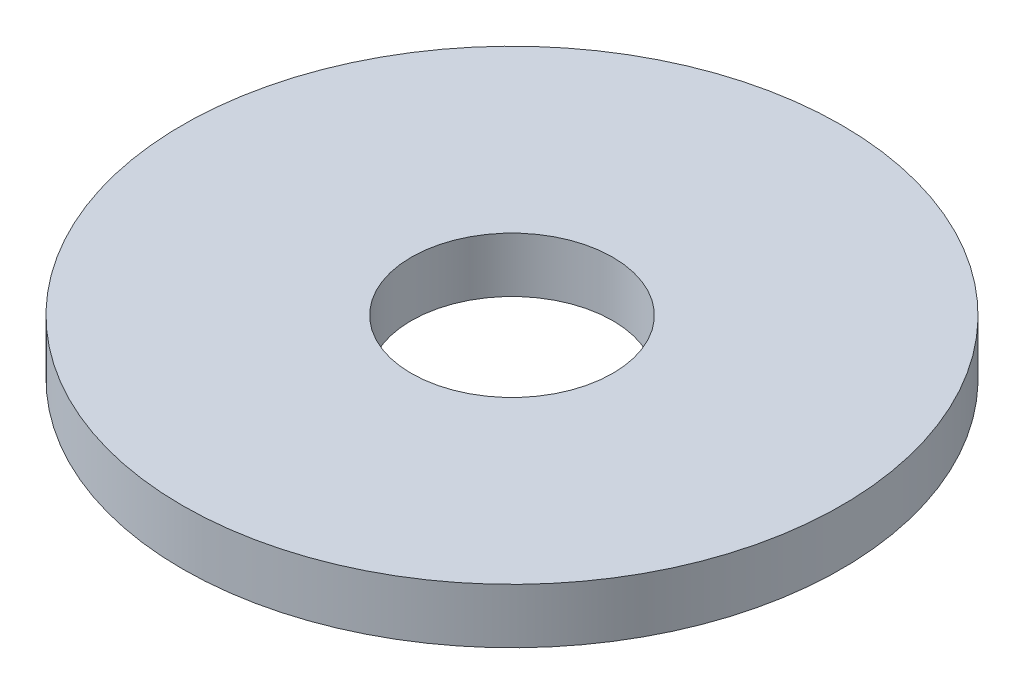
ISO-10303-21;
HEADER;
FILE_DESCRIPTION(('STEP AP214'),'2;1');
FILE_NAME('part.step','',(''),(''),'','','');
FILE_SCHEMA(('AUTOMOTIVE_DESIGN { 1 0 10303 214 1 1 1 1 }'));
ENDSEC;
DATA;
#1=APPLICATION_CONTEXT('core data for automotive mechanical design processes');
#2=APPLICATION_PROTOCOL_DEFINITION('international standard','automotive_design',2000,#1);
#3=PRODUCT_CONTEXT('',#1,'mechanical');
#4=PRODUCT('Part','Part','',(#3));
#5=PRODUCT_RELATED_PRODUCT_CATEGORY('part','',(#4));
#6=PRODUCT_DEFINITION_FORMATION('','',#4);
#7=PRODUCT_DEFINITION_CONTEXT('part definition',#1,'design');
#8=PRODUCT_DEFINITION('design','',#6,#7);
#9=PRODUCT_DEFINITION_SHAPE('','',#8);
#10=(LENGTH_UNIT() NAMED_UNIT(*) SI_UNIT(.MILLI.,.METRE.));
#11=(NAMED_UNIT(*) PLANE_ANGLE_UNIT() SI_UNIT($,.RADIAN.));
#12=(NAMED_UNIT(*) SI_UNIT($,.STERADIAN.) SOLID_ANGLE_UNIT());
#13=UNCERTAINTY_MEASURE_WITH_UNIT(LENGTH_MEASURE(1.E-05),#10,'distance_accuracy_value','');
#14=(GEOMETRIC_REPRESENTATION_CONTEXT(3) GLOBAL_UNCERTAINTY_ASSIGNED_CONTEXT((#13)) GLOBAL_UNIT_ASSIGNED_CONTEXT((#10,
#11,#12)) REPRESENTATION_CONTEXT('',''));
#15=CARTESIAN_POINT('',(0.,0.,0.));
#16=DIRECTION('',(0.,0.,1.));
#17=DIRECTION('',(1.,0.,0.));
#18=AXIS2_PLACEMENT_3D('',#15,#16,#17);
#19=CARTESIAN_POINT('',(0.,-6.,0.));
#20=DIRECTION('',(0.,1.,0.));
#21=DIRECTION('',(0.,0.,1.));
#22=AXIS2_PLACEMENT_3D('',#19,#20,#21);
#23=CYLINDRICAL_SURFACE('',#22,36.);
#24=CARTESIAN_POINT('',(0.,-6.,0.));
#25=DIRECTION('',(0.,1.,0.));
#26=DIRECTION('',(0.,0.,1.));
#27=AXIS2_PLACEMENT_3D('',#24,#25,#26);
#28=CIRCLE('',#27,36.);
#29=CARTESIAN_POINT('',(0.,-6.,36.));
#30=VERTEX_POINT('',#29);
#31=EDGE_CURVE('E10',#30,#30,#28,.T.);
#32=ORIENTED_EDGE('',*,*,#31,.T.);
#33=EDGE_LOOP('',(#32));
#34=FACE_BOUND('',#33,.T.);
#35=CARTESIAN_POINT('',(0.,0.,0.));
#36=DIRECTION('',(0.,1.,0.));
#37=DIRECTION('',(0.,0.,1.));
#38=AXIS2_PLACEMENT_3D('',#35,#36,#37);
#39=CIRCLE('',#38,36.);
#40=CARTESIAN_POINT('',(0.,0.,36.));
#41=VERTEX_POINT('',#40);
#42=EDGE_CURVE('E33',#41,#41,#39,.T.);
#43=ORIENTED_EDGE('',*,*,#42,.F.);
#44=EDGE_LOOP('',(#43));
#45=FACE_BOUND('',#44,.T.);
#46=ADVANCED_FACE('F30',(#34,#45),#23,.T.);
#47=CARTESIAN_POINT('',(0.,-6.,0.));
#48=DIRECTION('',(0.,1.,0.));
#49=DIRECTION('',(0.,0.,1.));
#50=AXIS2_PLACEMENT_3D('',#47,#48,#49);
#51=PLANE('',#50);
#52=CARTESIAN_POINT('',(0.,-6.,0.));
#53=DIRECTION('',(0.,1.,0.));
#54=DIRECTION('',(0.,0.,1.));
#55=AXIS2_PLACEMENT_3D('',#52,#53,#54);
#56=CIRCLE('',#55,11.);
#57=CARTESIAN_POINT('',(0.,-6.,11.));
#58=VERTEX_POINT('',#57);
#59=EDGE_CURVE('E40',#58,#58,#56,.T.);
#60=ORIENTED_EDGE('',*,*,#59,.T.);
#61=EDGE_LOOP('',(#60));
#62=FACE_BOUND('',#61,.T.);
#63=ORIENTED_EDGE('',*,*,#31,.F.);
#64=EDGE_LOOP('',(#63));
#65=FACE_BOUND('',#64,.T.);
#66=ADVANCED_FACE('F48',(#62,#65),#51,.F.);
#67=CARTESIAN_POINT('',(0.,0.,0.));
#68=DIRECTION('',(0.,1.,0.));
#69=DIRECTION('',(0.,0.,1.));
#70=AXIS2_PLACEMENT_3D('',#67,#68,#69);
#71=PLANE('',#70);
#72=CARTESIAN_POINT('',(0.,0.,0.));
#73=DIRECTION('',(0.,1.,0.));
#74=DIRECTION('',(0.,0.,1.));
#75=AXIS2_PLACEMENT_3D('',#72,#73,#74);
#76=CIRCLE('',#75,11.);
#77=CARTESIAN_POINT('',(0.,0.,11.));
#78=VERTEX_POINT('',#77);
#79=EDGE_CURVE('E42',#78,#78,#76,.T.);
#80=ORIENTED_EDGE('',*,*,#79,.F.);
#81=EDGE_LOOP('',(#80));
#82=FACE_BOUND('',#81,.T.);
#83=ORIENTED_EDGE('',*,*,#42,.T.);
#84=EDGE_LOOP('',(#83));
#85=FACE_BOUND('',#84,.T.);
#86=ADVANCED_FACE('F54',(#82,#85),#71,.T.);
#87=CARTESIAN_POINT('',(0.,-6.,0.));
#88=DIRECTION('',(0.,1.,0.));
#89=DIRECTION('',(0.,0.,1.));
#90=AXIS2_PLACEMENT_3D('',#87,#88,#89);
#91=CYLINDRICAL_SURFACE('',#90,11.);
#92=ORIENTED_EDGE('',*,*,#59,.F.);
#93=EDGE_LOOP('',(#92));
#94=FACE_BOUND('',#93,.T.);
#95=ORIENTED_EDGE('',*,*,#79,.T.);
#96=EDGE_LOOP('',(#95));
#97=FACE_BOUND('',#96,.T.);
#98=ADVANCED_FACE('F51',(#94,#97),#91,.F.);
#99=CLOSED_SHELL('',(#46,#66,#86,#98));
#100=MANIFOLD_SOLID_BREP('B2',#99);
#101=ADVANCED_BREP_SHAPE_REPRESENTATION('',(#18,#100),#14);
#102=SHAPE_DEFINITION_REPRESENTATION(#9,#101);
ENDSEC;
END-ISO-10303-21;
